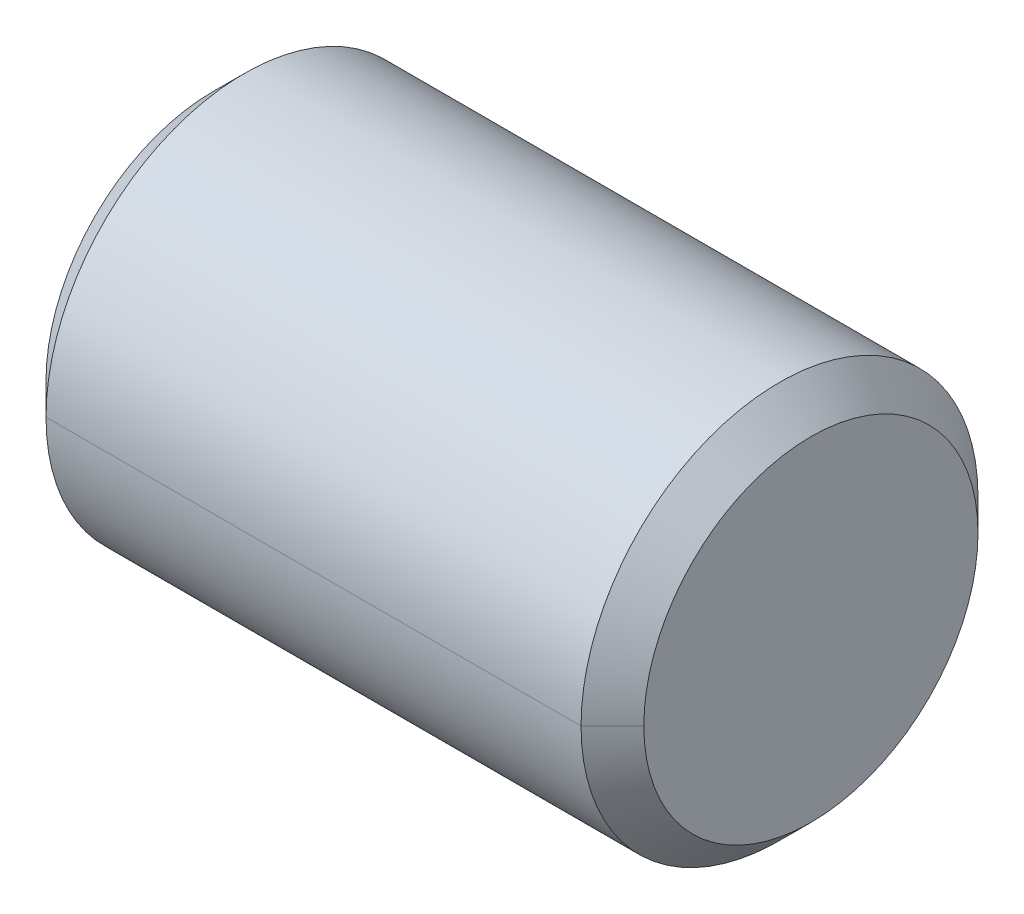
ISO-10303-21;
HEADER;
FILE_DESCRIPTION(('STEP AP214'),'2;1');
FILE_NAME('part.step','',(''),(''),'','','');
FILE_SCHEMA(('AUTOMOTIVE_DESIGN { 1 0 10303 214 1 1 1 1 }'));
ENDSEC;
DATA;
#1=APPLICATION_CONTEXT('core data for automotive mechanical design processes');
#2=APPLICATION_PROTOCOL_DEFINITION('international standard','automotive_design',2000,#1);
#3=PRODUCT_CONTEXT('',#1,'mechanical');
#4=PRODUCT('Part','Part','',(#3));
#5=PRODUCT_RELATED_PRODUCT_CATEGORY('part','',(#4));
#6=PRODUCT_DEFINITION_FORMATION('','',#4);
#7=PRODUCT_DEFINITION_CONTEXT('part definition',#1,'design');
#8=PRODUCT_DEFINITION('design','',#6,#7);
#9=PRODUCT_DEFINITION_SHAPE('','',#8);
#10=(LENGTH_UNIT() NAMED_UNIT(*) SI_UNIT(.MILLI.,.METRE.));
#11=(NAMED_UNIT(*) PLANE_ANGLE_UNIT() SI_UNIT($,.RADIAN.));
#12=(NAMED_UNIT(*) SI_UNIT($,.STERADIAN.) SOLID_ANGLE_UNIT());
#13=UNCERTAINTY_MEASURE_WITH_UNIT(LENGTH_MEASURE(1.E-05),#10,'distance_accuracy_value','');
#14=(GEOMETRIC_REPRESENTATION_CONTEXT(3) GLOBAL_UNCERTAINTY_ASSIGNED_CONTEXT((#13)) GLOBAL_UNIT_ASSIGNED_CONTEXT((#10,
#11,#12)) REPRESENTATION_CONTEXT('',''));
#15=CARTESIAN_POINT('',(0.,0.,0.));
#16=DIRECTION('',(0.,0.,1.));
#17=DIRECTION('',(1.,0.,0.));
#18=AXIS2_PLACEMENT_3D('',#15,#16,#17);
#19=CARTESIAN_POINT('',(4.7625,0.,0.));
#20=DIRECTION('',(-1.,0.,0.));
#21=DIRECTION('',(0.,0.,1.));
#22=AXIS2_PLACEMENT_3D('',#19,#20,#21);
#23=CONICAL_SURFACE('',#22,2.6623,0.785398163397448);
#24=DIRECTION('',(-0.707106781186548,0.,-0.707106781186547));
#25=VECTOR('',#24,1.);
#26=CARTESIAN_POINT('',(4.7625,0.,-2.6623));
#27=LINE('',#26,#25);
#28=CARTESIAN_POINT('',(4.7625,0.,-2.6623));
#29=VERTEX_POINT('',#28);
#30=CARTESIAN_POINT('',(4.2625,0.,-3.1623));
#31=VERTEX_POINT('',#30);
#32=EDGE_CURVE('E74',#29,#31,#27,.T.);
#33=ORIENTED_EDGE('',*,*,#32,.F.);
#34=CARTESIAN_POINT('',(4.7625,0.,0.));
#35=DIRECTION('',(1.,0.,0.));
#36=DIRECTION('',(0.,0.,-1.));
#37=AXIS2_PLACEMENT_3D('',#34,#35,#36);
#38=CIRCLE('',#37,2.6623);
#39=CARTESIAN_POINT('',(4.7625,0.,2.6623));
#40=VERTEX_POINT('',#39);
#41=EDGE_CURVE('E27',#40,#29,#38,.T.);
#42=ORIENTED_EDGE('',*,*,#41,.F.);
#43=DIRECTION('',(-0.707106781186548,0.,0.707106781186547));
#44=VECTOR('',#43,1.);
#45=CARTESIAN_POINT('',(4.7625,0.,2.6623));
#46=LINE('',#45,#44);
#47=CARTESIAN_POINT('',(4.2625,0.,3.1623));
#48=VERTEX_POINT('',#47);
#49=EDGE_CURVE('E76',#40,#48,#46,.T.);
#50=ORIENTED_EDGE('',*,*,#49,.T.);
#51=CARTESIAN_POINT('',(4.2625,0.,0.));
#52=DIRECTION('',(-1.,0.,0.));
#53=DIRECTION('',(0.,0.,-1.));
#54=AXIS2_PLACEMENT_3D('',#51,#52,#53);
#55=CIRCLE('',#54,3.1623);
#56=EDGE_CURVE('E72',#31,#48,#55,.T.);
#57=ORIENTED_EDGE('',*,*,#56,.F.);
#58=EDGE_LOOP('',(#33,#42,#50,#57));
#59=FACE_BOUND('',#58,.T.);
#60=ADVANCED_FACE('F16',(#59),#23,.T.);
#61=CARTESIAN_POINT('',(-4.2625,0.,0.));
#62=DIRECTION('',(1.,0.,0.));
#63=DIRECTION('',(0.,0.,-1.));
#64=AXIS2_PLACEMENT_3D('',#61,#62,#63);
#65=CONICAL_SURFACE('',#64,3.1623,0.785398163397452);
#66=DIRECTION('',(0.707106781186545,0.,0.70710678118655));
#67=VECTOR('',#66,1.);
#68=CARTESIAN_POINT('',(-4.2625,0.,3.1623));
#69=LINE('',#68,#67);
#70=CARTESIAN_POINT('',(-4.7625,0.,2.6623));
#71=VERTEX_POINT('',#70);
#72=CARTESIAN_POINT('',(-4.2625,0.,3.1623));
#73=VERTEX_POINT('',#72);
#74=EDGE_CURVE('E112',#71,#73,#69,.T.);
#75=ORIENTED_EDGE('',*,*,#74,.F.);
#76=CARTESIAN_POINT('',(-4.7625,0.,0.));
#77=DIRECTION('',(-1.,0.,0.));
#78=DIRECTION('',(0.,0.,-1.));
#79=AXIS2_PLACEMENT_3D('',#76,#77,#78);
#80=CIRCLE('',#79,2.6623);
#81=CARTESIAN_POINT('',(-4.7625,0.,-2.6623));
#82=VERTEX_POINT('',#81);
#83=EDGE_CURVE('E11',#82,#71,#80,.T.);
#84=ORIENTED_EDGE('',*,*,#83,.F.);
#85=DIRECTION('',(0.707106781186545,0.,-0.70710678118655));
#86=VECTOR('',#85,1.);
#87=CARTESIAN_POINT('',(-4.2625,0.,-3.1623));
#88=LINE('',#87,#86);
#89=CARTESIAN_POINT('',(-4.2625,0.,-3.1623));
#90=VERTEX_POINT('',#89);
#91=EDGE_CURVE('E20',#82,#90,#88,.T.);
#92=ORIENTED_EDGE('',*,*,#91,.T.);
#93=CARTESIAN_POINT('',(-4.2625,0.,0.));
#94=DIRECTION('',(1.,0.,0.));
#95=DIRECTION('',(0.,0.,-1.));
#96=AXIS2_PLACEMENT_3D('',#93,#94,#95);
#97=CIRCLE('',#96,3.1623);
#98=EDGE_CURVE('E41',#73,#90,#97,.T.);
#99=ORIENTED_EDGE('',*,*,#98,.F.);
#100=EDGE_LOOP('',(#75,#84,#92,#99));
#101=FACE_BOUND('',#100,.T.);
#102=ADVANCED_FACE('F143',(#101),#65,.T.);
#103=CARTESIAN_POINT('',(-4.7625,0.,0.));
#104=DIRECTION('',(1.,0.,0.));
#105=DIRECTION('',(0.,1.,0.));
#106=AXIS2_PLACEMENT_3D('',#103,#104,#105);
#107=PLANE('',#106);
#108=ORIENTED_EDGE('',*,*,#83,.T.);
#109=CARTESIAN_POINT('',(-4.7625,0.,0.));
#110=DIRECTION('',(-1.,0.,0.));
#111=DIRECTION('',(0.,0.,-1.));
#112=AXIS2_PLACEMENT_3D('',#109,#110,#111);
#113=CIRCLE('',#112,2.6623);
#114=EDGE_CURVE('E107',#71,#82,#113,.T.);
#115=ORIENTED_EDGE('',*,*,#114,.T.);
#116=EDGE_LOOP('',(#108,#115));
#117=FACE_BOUND('',#116,.T.);
#118=ADVANCED_FACE('F18',(#117),#107,.F.);
#119=CARTESIAN_POINT('',(4.7625,0.,0.));
#120=DIRECTION('',(1.,0.,0.));
#121=DIRECTION('',(0.,1.,0.));
#122=AXIS2_PLACEMENT_3D('',#119,#120,#121);
#123=PLANE('',#122);
#124=ORIENTED_EDGE('',*,*,#41,.T.);
#125=CARTESIAN_POINT('',(4.7625,0.,0.));
#126=DIRECTION('',(1.,0.,0.));
#127=DIRECTION('',(0.,0.,-1.));
#128=AXIS2_PLACEMENT_3D('',#125,#126,#127);
#129=CIRCLE('',#128,2.6623);
#130=EDGE_CURVE('E97',#29,#40,#129,.T.);
#131=ORIENTED_EDGE('',*,*,#130,.T.);
#132=EDGE_LOOP('',(#124,#131));
#133=FACE_BOUND('',#132,.T.);
#134=ADVANCED_FACE('F156',(#133),#123,.T.);
#135=CARTESIAN_POINT('',(4.7625,0.,0.));
#136=DIRECTION('',(-1.,0.,0.));
#137=DIRECTION('',(0.,0.,1.));
#138=AXIS2_PLACEMENT_3D('',#135,#136,#137);
#139=CYLINDRICAL_SURFACE('',#138,3.1623);
#140=DIRECTION('',(-1.,0.,0.));
#141=VECTOR('',#140,1.);
#142=CARTESIAN_POINT('',(4.7625,0.,-3.1623));
#143=LINE('',#142,#141);
#144=EDGE_CURVE('E82',#31,#90,#143,.T.);
#145=ORIENTED_EDGE('',*,*,#144,.F.);
#146=ORIENTED_EDGE('',*,*,#56,.T.);
#147=DIRECTION('',(-1.,0.,0.));
#148=VECTOR('',#147,1.);
#149=CARTESIAN_POINT('',(4.7625,0.,3.1623));
#150=LINE('',#149,#148);
#151=EDGE_CURVE('E80',#48,#73,#150,.T.);
#152=ORIENTED_EDGE('',*,*,#151,.T.);
#153=ORIENTED_EDGE('',*,*,#98,.T.);
#154=EDGE_LOOP('',(#145,#146,#152,#153));
#155=FACE_BOUND('',#154,.T.);
#156=ADVANCED_FACE('F84',(#155),#139,.T.);
#157=CARTESIAN_POINT('',(4.7625,0.,0.));
#158=DIRECTION('',(-1.,0.,0.));
#159=DIRECTION('',(0.,0.,1.));
#160=AXIS2_PLACEMENT_3D('',#157,#158,#159);
#161=CYLINDRICAL_SURFACE('',#160,3.1623);
#162=CARTESIAN_POINT('',(4.2625,0.,0.));
#163=DIRECTION('',(-1.,0.,0.));
#164=DIRECTION('',(0.,0.,-1.));
#165=AXIS2_PLACEMENT_3D('',#162,#163,#164);
#166=CIRCLE('',#165,3.1623);
#167=EDGE_CURVE('E90',#48,#31,#166,.T.);
#168=ORIENTED_EDGE('',*,*,#167,.T.);
#169=ORIENTED_EDGE('',*,*,#144,.T.);
#170=CARTESIAN_POINT('',(-4.2625,0.,0.));
#171=DIRECTION('',(1.,0.,0.));
#172=DIRECTION('',(0.,0.,-1.));
#173=AXIS2_PLACEMENT_3D('',#170,#171,#172);
#174=CIRCLE('',#173,3.1623);
#175=EDGE_CURVE('E116',#90,#73,#174,.T.);
#176=ORIENTED_EDGE('',*,*,#175,.T.);
#177=ORIENTED_EDGE('',*,*,#151,.F.);
#178=EDGE_LOOP('',(#168,#169,#176,#177));
#179=FACE_BOUND('',#178,.T.);
#180=ADVANCED_FACE('F91',(#179),#161,.T.);
#181=CARTESIAN_POINT('',(-4.2625,0.,0.));
#182=DIRECTION('',(1.,0.,0.));
#183=DIRECTION('',(0.,0.,-1.));
#184=AXIS2_PLACEMENT_3D('',#181,#182,#183);
#185=CONICAL_SURFACE('',#184,3.1623,0.785398163397452);
#186=ORIENTED_EDGE('',*,*,#114,.F.);
#187=ORIENTED_EDGE('',*,*,#74,.T.);
#188=ORIENTED_EDGE('',*,*,#175,.F.);
#189=ORIENTED_EDGE('',*,*,#91,.F.);
#190=EDGE_LOOP('',(#186,#187,#188,#189));
#191=FACE_BOUND('',#190,.T.);
#192=ADVANCED_FACE('F179',(#191),#185,.T.);
#193=CARTESIAN_POINT('',(4.7625,0.,0.));
#194=DIRECTION('',(-1.,0.,0.));
#195=DIRECTION('',(0.,0.,1.));
#196=AXIS2_PLACEMENT_3D('',#193,#194,#195);
#197=CONICAL_SURFACE('',#196,2.6623,0.785398163397448);
#198=ORIENTED_EDGE('',*,*,#130,.F.);
#199=ORIENTED_EDGE('',*,*,#32,.T.);
#200=ORIENTED_EDGE('',*,*,#167,.F.);
#201=ORIENTED_EDGE('',*,*,#49,.F.);
#202=EDGE_LOOP('',(#198,#199,#200,#201));
#203=FACE_BOUND('',#202,.T.);
#204=ADVANCED_FACE('F95',(#203),#197,.T.);
#205=CLOSED_SHELL('',(#60,#102,#118,#134,#156,#180,#192,#204));
#206=MANIFOLD_SOLID_BREP('B1',#205);
#207=ADVANCED_BREP_SHAPE_REPRESENTATION('',(#18,#206),#14);
#208=SHAPE_DEFINITION_REPRESENTATION(#9,#207);
ENDSEC;
END-ISO-10303-21;
